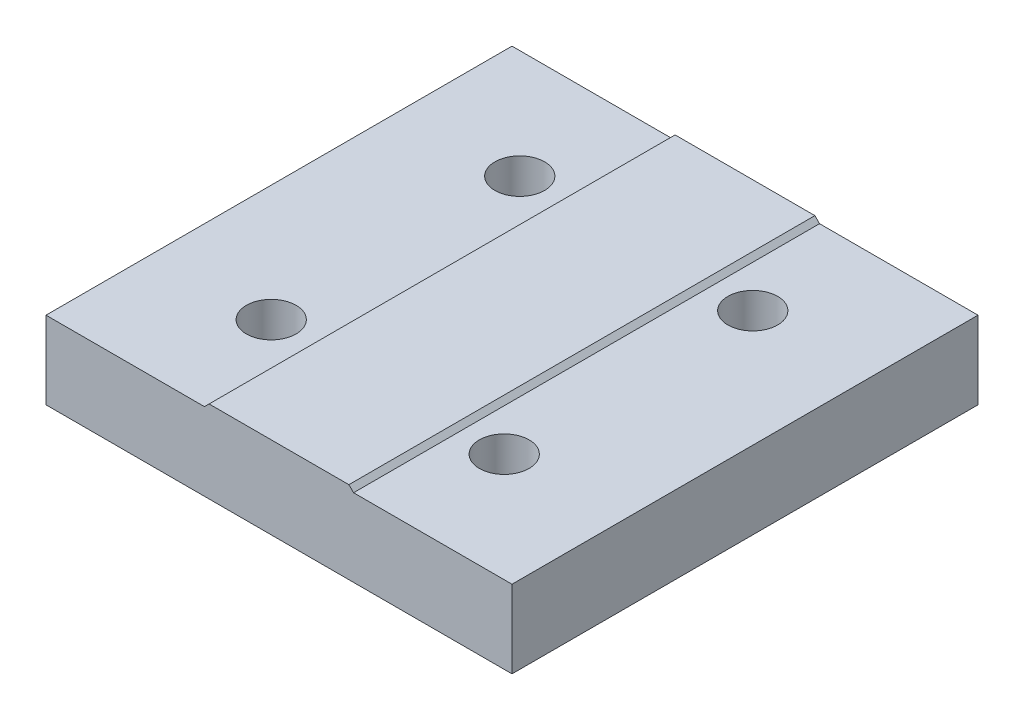
ISO-10303-21;
HEADER;
FILE_DESCRIPTION(('STEP AP214'),'2;1');
FILE_NAME('part.step','',(''),(''),'','','');
FILE_SCHEMA(('AUTOMOTIVE_DESIGN { 1 0 10303 214 1 1 1 1 }'));
ENDSEC;
DATA;
#1=APPLICATION_CONTEXT('core data for automotive mechanical design processes');
#2=APPLICATION_PROTOCOL_DEFINITION('international standard','automotive_design',2000,#1);
#3=PRODUCT_CONTEXT('',#1,'mechanical');
#4=PRODUCT('Part','Part','',(#3));
#5=PRODUCT_RELATED_PRODUCT_CATEGORY('part','',(#4));
#6=PRODUCT_DEFINITION_FORMATION('','',#4);
#7=PRODUCT_DEFINITION_CONTEXT('part definition',#1,'design');
#8=PRODUCT_DEFINITION('design','',#6,#7);
#9=PRODUCT_DEFINITION_SHAPE('','',#8);
#10=(LENGTH_UNIT() NAMED_UNIT(*) SI_UNIT(.MILLI.,.METRE.));
#11=(NAMED_UNIT(*) PLANE_ANGLE_UNIT() SI_UNIT($,.RADIAN.));
#12=(NAMED_UNIT(*) SI_UNIT($,.STERADIAN.) SOLID_ANGLE_UNIT());
#13=UNCERTAINTY_MEASURE_WITH_UNIT(LENGTH_MEASURE(1.E-05),#10,'distance_accuracy_value','');
#14=(GEOMETRIC_REPRESENTATION_CONTEXT(3) GLOBAL_UNCERTAINTY_ASSIGNED_CONTEXT((#13)) GLOBAL_UNIT_ASSIGNED_CONTEXT((#10,
#11,#12)) REPRESENTATION_CONTEXT('',''));
#15=CARTESIAN_POINT('',(0.,0.,0.));
#16=DIRECTION('',(0.,0.,1.));
#17=DIRECTION('',(1.,0.,0.));
#18=AXIS2_PLACEMENT_3D('',#15,#16,#17);
#19=CARTESIAN_POINT('',(0.,5.,0.));
#20=DIRECTION('',(0.,1.,0.));
#21=DIRECTION('',(0.,0.,1.));
#22=AXIS2_PLACEMENT_3D('',#19,#20,#21);
#23=PLANE('',#22);
#24=DIRECTION('',(0.,0.,1.));
#25=VECTOR('',#24,1.);
#26=CARTESIAN_POINT('',(10.2,5.,0.));
#27=LINE('',#26,#25);
#28=CARTESIAN_POINT('',(10.2,5.,0.));
#29=VERTEX_POINT('',#28);
#30=CARTESIAN_POINT('',(10.2,5.,30.));
#31=VERTEX_POINT('',#30);
#32=EDGE_CURVE('E123',#29,#31,#27,.T.);
#33=ORIENTED_EDGE('',*,*,#32,.F.);
#34=DIRECTION('',(-1.,0.,0.));
#35=VECTOR('',#34,1.);
#36=CARTESIAN_POINT('',(0.,5.,0.));
#37=LINE('',#36,#35);
#38=CARTESIAN_POINT('',(0.,5.,0.));
#39=VERTEX_POINT('',#38);
#40=EDGE_CURVE('E118',#29,#39,#37,.T.);
#41=ORIENTED_EDGE('',*,*,#40,.T.);
#42=DIRECTION('',(0.,0.,1.));
#43=VECTOR('',#42,1.);
#44=CARTESIAN_POINT('',(0.,5.,0.));
#45=LINE('',#44,#43);
#46=CARTESIAN_POINT('',(0.,5.,30.));
#47=VERTEX_POINT('',#46);
#48=EDGE_CURVE('E156',#39,#47,#45,.T.);
#49=ORIENTED_EDGE('',*,*,#48,.T.);
#50=DIRECTION('',(1.,0.,0.));
#51=VECTOR('',#50,1.);
#52=CARTESIAN_POINT('',(0.,5.,30.));
#53=LINE('',#52,#51);
#54=EDGE_CURVE('E161',#47,#31,#53,.T.);
#55=ORIENTED_EDGE('',*,*,#54,.T.);
#56=EDGE_LOOP('',(#33,#41,#49,#55));
#57=FACE_BOUND('',#56,.T.);
#58=CARTESIAN_POINT('',(7.50000000000017,5.,23.));
#59=DIRECTION('',(0.,1.,0.));
#60=DIRECTION('',(0.,0.,1.));
#61=AXIS2_PLACEMENT_3D('',#58,#59,#60);
#62=CIRCLE('',#61,1.6);
#63=CARTESIAN_POINT('',(7.50000000000017,5.,24.6));
#64=VERTEX_POINT('',#63);
#65=EDGE_CURVE('E131',#64,#64,#62,.T.);
#66=ORIENTED_EDGE('',*,*,#65,.F.);
#67=EDGE_LOOP('',(#66));
#68=FACE_BOUND('',#67,.T.);
#69=CARTESIAN_POINT('',(7.5,5.,7.));
#70=DIRECTION('',(0.,1.,0.));
#71=DIRECTION('',(0.,0.,1.));
#72=AXIS2_PLACEMENT_3D('',#69,#70,#71);
#73=CIRCLE('',#72,1.6);
#74=CARTESIAN_POINT('',(7.5,5.,8.6));
#75=VERTEX_POINT('',#74);
#76=EDGE_CURVE('E150',#75,#75,#73,.T.);
#77=ORIENTED_EDGE('',*,*,#76,.F.);
#78=EDGE_LOOP('',(#77));
#79=FACE_BOUND('',#78,.T.);
#80=ADVANCED_FACE('F37',(#57,#68,#79),#23,.T.);
#81=DIRECTION('',(0.,0.,-1.));
#82=VECTOR('',#81,1.);
#83=CARTESIAN_POINT('',(19.8,5.,0.));
#84=LINE('',#83,#82);
#85=CARTESIAN_POINT('',(19.8,5.,30.));
#86=VERTEX_POINT('',#85);
#87=CARTESIAN_POINT('',(19.8,5.,0.));
#88=VERTEX_POINT('',#87);
#89=EDGE_CURVE('E112',#86,#88,#84,.T.);
#90=ORIENTED_EDGE('',*,*,#89,.F.);
#91=CARTESIAN_POINT('',(30.,5.,30.));
#92=VERTEX_POINT('',#91);
#93=EDGE_CURVE('E159',#86,#92,#53,.T.);
#94=ORIENTED_EDGE('',*,*,#93,.T.);
#95=DIRECTION('',(0.,0.,-1.));
#96=VECTOR('',#95,1.);
#97=CARTESIAN_POINT('',(30.,5.,0.));
#98=LINE('',#97,#96);
#99=CARTESIAN_POINT('',(30.,5.,0.));
#100=VERTEX_POINT('',#99);
#101=EDGE_CURVE('E115',#92,#100,#98,.T.);
#102=ORIENTED_EDGE('',*,*,#101,.T.);
#103=EDGE_CURVE('E106',#100,#88,#37,.T.);
#104=ORIENTED_EDGE('',*,*,#103,.T.);
#105=EDGE_LOOP('',(#90,#94,#102,#104));
#106=FACE_BOUND('',#105,.T.);
#107=CARTESIAN_POINT('',(22.5000000000002,5.,23.));
#108=DIRECTION('',(0.,1.,0.));
#109=DIRECTION('',(0.,0.,1.));
#110=AXIS2_PLACEMENT_3D('',#107,#108,#109);
#111=CIRCLE('',#110,1.6);
#112=CARTESIAN_POINT('',(22.5000000000002,5.,24.6));
#113=VERTEX_POINT('',#112);
#114=EDGE_CURVE('E138',#113,#113,#111,.T.);
#115=ORIENTED_EDGE('',*,*,#114,.F.);
#116=EDGE_LOOP('',(#115));
#117=FACE_BOUND('',#116,.T.);
#118=CARTESIAN_POINT('',(22.5,5.,7.));
#119=DIRECTION('',(0.,1.,0.));
#120=DIRECTION('',(0.,0.,1.));
#121=AXIS2_PLACEMENT_3D('',#118,#119,#120);
#122=CIRCLE('',#121,1.6);
#123=CARTESIAN_POINT('',(22.5,5.,8.6));
#124=VERTEX_POINT('',#123);
#125=EDGE_CURVE('E144',#124,#124,#122,.T.);
#126=ORIENTED_EDGE('',*,*,#125,.F.);
#127=EDGE_LOOP('',(#126));
#128=FACE_BOUND('',#127,.T.);
#129=ADVANCED_FACE('F110',(#106,#117,#128),#23,.T.);
#130=CARTESIAN_POINT('',(0.,0.,0.));
#131=DIRECTION('',(0.,1.,0.));
#132=DIRECTION('',(0.,0.,1.));
#133=AXIS2_PLACEMENT_3D('',#130,#131,#132);
#134=PLANE('',#133);
#135=DIRECTION('',(0.,0.,1.));
#136=VECTOR('',#135,1.);
#137=CARTESIAN_POINT('',(0.,0.,0.));
#138=LINE('',#137,#136);
#139=CARTESIAN_POINT('',(0.,0.,0.));
#140=VERTEX_POINT('',#139);
#141=CARTESIAN_POINT('',(0.,0.,30.));
#142=VERTEX_POINT('',#141);
#143=EDGE_CURVE('E153',#140,#142,#138,.T.);
#144=ORIENTED_EDGE('',*,*,#143,.F.);
#145=DIRECTION('',(-1.,0.,0.));
#146=VECTOR('',#145,1.);
#147=CARTESIAN_POINT('',(0.,0.,0.));
#148=LINE('',#147,#146);
#149=CARTESIAN_POINT('',(30.,0.,0.));
#150=VERTEX_POINT('',#149);
#151=EDGE_CURVE('E160',#150,#140,#148,.T.);
#152=ORIENTED_EDGE('',*,*,#151,.F.);
#153=DIRECTION('',(0.,0.,-1.));
#154=VECTOR('',#153,1.);
#155=CARTESIAN_POINT('',(30.,0.,0.));
#156=LINE('',#155,#154);
#157=CARTESIAN_POINT('',(30.,0.,30.));
#158=VERTEX_POINT('',#157);
#159=EDGE_CURVE('E169',#158,#150,#156,.T.);
#160=ORIENTED_EDGE('',*,*,#159,.F.);
#161=DIRECTION('',(1.,0.,0.));
#162=VECTOR('',#161,1.);
#163=CARTESIAN_POINT('',(0.,0.,30.));
#164=LINE('',#163,#162);
#165=EDGE_CURVE('E167',#142,#158,#164,.T.);
#166=ORIENTED_EDGE('',*,*,#165,.F.);
#167=EDGE_LOOP('',(#144,#152,#160,#166));
#168=FACE_BOUND('',#167,.T.);
#169=CARTESIAN_POINT('',(7.5,0.,7.));
#170=DIRECTION('',(0.,1.,0.));
#171=DIRECTION('',(0.,0.,1.));
#172=AXIS2_PLACEMENT_3D('',#169,#170,#171);
#173=CIRCLE('',#172,1.6);
#174=CARTESIAN_POINT('',(7.5,0.,8.6));
#175=VERTEX_POINT('',#174);
#176=EDGE_CURVE('E147',#175,#175,#173,.T.);
#177=ORIENTED_EDGE('',*,*,#176,.T.);
#178=EDGE_LOOP('',(#177));
#179=FACE_BOUND('',#178,.T.);
#180=CARTESIAN_POINT('',(22.5,0.,7.));
#181=DIRECTION('',(0.,1.,0.));
#182=DIRECTION('',(0.,0.,1.));
#183=AXIS2_PLACEMENT_3D('',#180,#181,#182);
#184=CIRCLE('',#183,1.6);
#185=CARTESIAN_POINT('',(22.5,0.,8.6));
#186=VERTEX_POINT('',#185);
#187=EDGE_CURVE('E141',#186,#186,#184,.T.);
#188=ORIENTED_EDGE('',*,*,#187,.T.);
#189=EDGE_LOOP('',(#188));
#190=FACE_BOUND('',#189,.T.);
#191=CARTESIAN_POINT('',(22.5000000000002,0.,23.));
#192=DIRECTION('',(0.,1.,0.));
#193=DIRECTION('',(0.,0.,1.));
#194=AXIS2_PLACEMENT_3D('',#191,#192,#193);
#195=CIRCLE('',#194,1.6);
#196=CARTESIAN_POINT('',(22.5000000000002,0.,24.6));
#197=VERTEX_POINT('',#196);
#198=EDGE_CURVE('E134',#197,#197,#195,.T.);
#199=ORIENTED_EDGE('',*,*,#198,.T.);
#200=EDGE_LOOP('',(#199));
#201=FACE_BOUND('',#200,.T.);
#202=CARTESIAN_POINT('',(7.50000000000017,0.,23.));
#203=DIRECTION('',(0.,1.,0.));
#204=DIRECTION('',(0.,0.,1.));
#205=AXIS2_PLACEMENT_3D('',#202,#203,#204);
#206=CIRCLE('',#205,1.6);
#207=CARTESIAN_POINT('',(7.50000000000017,0.,24.6));
#208=VERTEX_POINT('',#207);
#209=EDGE_CURVE('E135',#208,#208,#206,.T.);
#210=ORIENTED_EDGE('',*,*,#209,.T.);
#211=EDGE_LOOP('',(#210));
#212=FACE_BOUND('',#211,.T.);
#213=ADVANCED_FACE('F213',(#168,#179,#190,#201,#212),#134,.F.);
#214=CARTESIAN_POINT('',(0.,5.,0.));
#215=DIRECTION('',(1.,0.,0.));
#216=DIRECTION('',(0.,0.,-1.));
#217=AXIS2_PLACEMENT_3D('',#214,#215,#216);
#218=PLANE('',#217);
#219=ORIENTED_EDGE('',*,*,#143,.T.);
#220=DIRECTION('',(0.,-1.,0.));
#221=VECTOR('',#220,1.);
#222=CARTESIAN_POINT('',(0.,5.,30.));
#223=LINE('',#222,#221);
#224=EDGE_CURVE('E179',#47,#142,#223,.T.);
#225=ORIENTED_EDGE('',*,*,#224,.F.);
#226=ORIENTED_EDGE('',*,*,#48,.F.);
#227=DIRECTION('',(0.,-1.,0.));
#228=VECTOR('',#227,1.);
#229=CARTESIAN_POINT('',(0.,5.,0.));
#230=LINE('',#229,#228);
#231=EDGE_CURVE('E117',#39,#140,#230,.T.);
#232=ORIENTED_EDGE('',*,*,#231,.T.);
#233=EDGE_LOOP('',(#219,#225,#226,#232));
#234=FACE_BOUND('',#233,.T.);
#235=ADVANCED_FACE('F220',(#234),#218,.F.);
#236=CARTESIAN_POINT('',(0.,5.,30.));
#237=DIRECTION('',(0.,0.,-1.));
#238=DIRECTION('',(-1.,0.,0.));
#239=AXIS2_PLACEMENT_3D('',#236,#237,#238);
#240=PLANE('',#239);
#241=ORIENTED_EDGE('',*,*,#93,.F.);
#242=DIRECTION('',(-0.707106781186544,0.707106781186552,0.));
#243=VECTOR('',#242,1.);
#244=CARTESIAN_POINT('',(19.5,5.3,30.));
#245=LINE('',#244,#243);
#246=CARTESIAN_POINT('',(19.5,5.3,30.));
#247=VERTEX_POINT('',#246);
#248=EDGE_CURVE('E11',#86,#247,#245,.T.);
#249=ORIENTED_EDGE('',*,*,#248,.T.);
#250=DIRECTION('',(1.,0.,0.));
#251=VECTOR('',#250,1.);
#252=CARTESIAN_POINT('',(10.2,5.3,30.));
#253=LINE('',#252,#251);
#254=CARTESIAN_POINT('',(10.5,5.3,30.));
#255=VERTEX_POINT('',#254);
#256=EDGE_CURVE('E122',#255,#247,#253,.T.);
#257=ORIENTED_EDGE('',*,*,#256,.F.);
#258=DIRECTION('',(-0.707106781186548,-0.707106781186548,0.));
#259=VECTOR('',#258,1.);
#260=CARTESIAN_POINT('',(10.5,5.3,30.));
#261=LINE('',#260,#259);
#262=EDGE_CURVE('E46',#255,#31,#261,.T.);
#263=ORIENTED_EDGE('',*,*,#262,.T.);
#264=ORIENTED_EDGE('',*,*,#54,.F.);
#265=ORIENTED_EDGE('',*,*,#224,.T.);
#266=ORIENTED_EDGE('',*,*,#165,.T.);
#267=DIRECTION('',(0.,-1.,0.));
#268=VECTOR('',#267,1.);
#269=CARTESIAN_POINT('',(30.,5.,30.));
#270=LINE('',#269,#268);
#271=EDGE_CURVE('E176',#92,#158,#270,.T.);
#272=ORIENTED_EDGE('',*,*,#271,.F.);
#273=EDGE_LOOP('',(#241,#249,#257,#263,#264,#265,#266,#272));
#274=FACE_BOUND('',#273,.T.);
#275=ADVANCED_FACE('F189',(#274),#240,.F.);
#276=CARTESIAN_POINT('',(30.,5.,0.));
#277=DIRECTION('',(-1.,0.,0.));
#278=DIRECTION('',(0.,0.,1.));
#279=AXIS2_PLACEMENT_3D('',#276,#277,#278);
#280=PLANE('',#279);
#281=ORIENTED_EDGE('',*,*,#159,.T.);
#282=DIRECTION('',(0.,-1.,0.));
#283=VECTOR('',#282,1.);
#284=CARTESIAN_POINT('',(30.,5.,0.));
#285=LINE('',#284,#283);
#286=EDGE_CURVE('E174',#100,#150,#285,.T.);
#287=ORIENTED_EDGE('',*,*,#286,.F.);
#288=ORIENTED_EDGE('',*,*,#101,.F.);
#289=ORIENTED_EDGE('',*,*,#271,.T.);
#290=EDGE_LOOP('',(#281,#287,#288,#289));
#291=FACE_BOUND('',#290,.T.);
#292=ADVANCED_FACE('F224',(#291),#280,.F.);
#293=CARTESIAN_POINT('',(0.,5.,0.));
#294=DIRECTION('',(0.,0.,1.));
#295=DIRECTION('',(1.,0.,0.));
#296=AXIS2_PLACEMENT_3D('',#293,#294,#295);
#297=PLANE('',#296);
#298=DIRECTION('',(-1.,0.,0.));
#299=VECTOR('',#298,1.);
#300=CARTESIAN_POINT('',(10.2,5.3,0.));
#301=LINE('',#300,#299);
#302=CARTESIAN_POINT('',(19.5,5.3,0.));
#303=VERTEX_POINT('',#302);
#304=CARTESIAN_POINT('',(10.5,5.3,0.));
#305=VERTEX_POINT('',#304);
#306=EDGE_CURVE('E107',#303,#305,#301,.T.);
#307=ORIENTED_EDGE('',*,*,#306,.F.);
#308=DIRECTION('',(0.707106781186544,-0.707106781186552,0.));
#309=VECTOR('',#308,1.);
#310=CARTESIAN_POINT('',(19.5,5.3,0.));
#311=LINE('',#310,#309);
#312=EDGE_CURVE('E61',#303,#88,#311,.T.);
#313=ORIENTED_EDGE('',*,*,#312,.T.);
#314=ORIENTED_EDGE('',*,*,#103,.F.);
#315=ORIENTED_EDGE('',*,*,#286,.T.);
#316=ORIENTED_EDGE('',*,*,#151,.T.);
#317=ORIENTED_EDGE('',*,*,#231,.F.);
#318=ORIENTED_EDGE('',*,*,#40,.F.);
#319=DIRECTION('',(0.707106781186548,0.707106781186548,0.));
#320=VECTOR('',#319,1.);
#321=CARTESIAN_POINT('',(10.5,5.3,0.));
#322=LINE('',#321,#320);
#323=EDGE_CURVE('E53',#29,#305,#322,.T.);
#324=ORIENTED_EDGE('',*,*,#323,.T.);
#325=EDGE_LOOP('',(#307,#313,#314,#315,#316,#317,#318,#324));
#326=FACE_BOUND('',#325,.T.);
#327=ADVANCED_FACE('F104',(#326),#297,.F.);
#328=CARTESIAN_POINT('',(7.5,5.,7.));
#329=DIRECTION('',(0.,-1.,0.));
#330=DIRECTION('',(0.,0.,-1.));
#331=AXIS2_PLACEMENT_3D('',#328,#329,#330);
#332=CYLINDRICAL_SURFACE('',#331,1.6);
#333=ORIENTED_EDGE('',*,*,#76,.T.);
#334=EDGE_LOOP('',(#333));
#335=FACE_BOUND('',#334,.T.);
#336=ORIENTED_EDGE('',*,*,#176,.F.);
#337=EDGE_LOOP('',(#336));
#338=FACE_BOUND('',#337,.T.);
#339=ADVANCED_FACE('F216',(#335,#338),#332,.F.);
#340=CARTESIAN_POINT('',(22.5,5.,7.));
#341=DIRECTION('',(0.,-1.,0.));
#342=DIRECTION('',(0.,0.,-1.));
#343=AXIS2_PLACEMENT_3D('',#340,#341,#342);
#344=CYLINDRICAL_SURFACE('',#343,1.6);
#345=ORIENTED_EDGE('',*,*,#125,.T.);
#346=EDGE_LOOP('',(#345));
#347=FACE_BOUND('',#346,.T.);
#348=ORIENTED_EDGE('',*,*,#187,.F.);
#349=EDGE_LOOP('',(#348));
#350=FACE_BOUND('',#349,.T.);
#351=ADVANCED_FACE('F255',(#347,#350),#344,.F.);
#352=CARTESIAN_POINT('',(22.5000000000002,5.,23.));
#353=DIRECTION('',(0.,-1.,0.));
#354=DIRECTION('',(0.,0.,-1.));
#355=AXIS2_PLACEMENT_3D('',#352,#353,#354);
#356=CYLINDRICAL_SURFACE('',#355,1.6);
#357=ORIENTED_EDGE('',*,*,#114,.T.);
#358=EDGE_LOOP('',(#357));
#359=FACE_BOUND('',#358,.T.);
#360=ORIENTED_EDGE('',*,*,#198,.F.);
#361=EDGE_LOOP('',(#360));
#362=FACE_BOUND('',#361,.T.);
#363=ADVANCED_FACE('F205',(#359,#362),#356,.F.);
#364=CARTESIAN_POINT('',(7.50000000000017,5.,23.));
#365=DIRECTION('',(0.,-1.,0.));
#366=DIRECTION('',(0.,0.,-1.));
#367=AXIS2_PLACEMENT_3D('',#364,#365,#366);
#368=CYLINDRICAL_SURFACE('',#367,1.6);
#369=ORIENTED_EDGE('',*,*,#65,.T.);
#370=EDGE_LOOP('',(#369));
#371=FACE_BOUND('',#370,.T.);
#372=ORIENTED_EDGE('',*,*,#209,.F.);
#373=EDGE_LOOP('',(#372));
#374=FACE_BOUND('',#373,.T.);
#375=ADVANCED_FACE('F199',(#371,#374),#368,.F.);
#376=CARTESIAN_POINT('',(0.,5.3,0.));
#377=DIRECTION('',(0.,1.,0.));
#378=DIRECTION('',(0.,0.,1.));
#379=AXIS2_PLACEMENT_3D('',#376,#377,#378);
#380=PLANE('',#379);
#381=ORIENTED_EDGE('',*,*,#256,.T.);
#382=DIRECTION('',(0.,0.,-1.));
#383=VECTOR('',#382,1.);
#384=CARTESIAN_POINT('',(19.5,5.3,0.));
#385=LINE('',#384,#383);
#386=EDGE_CURVE('E185',#247,#303,#385,.T.);
#387=ORIENTED_EDGE('',*,*,#386,.T.);
#388=ORIENTED_EDGE('',*,*,#306,.T.);
#389=DIRECTION('',(0.,0.,1.));
#390=VECTOR('',#389,1.);
#391=CARTESIAN_POINT('',(10.5,5.3,30.));
#392=LINE('',#391,#390);
#393=EDGE_CURVE('E182',#305,#255,#392,.T.);
#394=ORIENTED_EDGE('',*,*,#393,.T.);
#395=EDGE_LOOP('',(#381,#387,#388,#394));
#396=FACE_BOUND('',#395,.T.);
#397=ADVANCED_FACE('F197',(#396),#380,.T.);
#398=CARTESIAN_POINT('',(19.5,5.3,0.));
#399=DIRECTION('',(0.707106781186552,0.707106781186544,0.));
#400=DIRECTION('',(0.,0.,1.));
#401=AXIS2_PLACEMENT_3D('',#398,#399,#400);
#402=PLANE('',#401);
#403=ORIENTED_EDGE('',*,*,#248,.F.);
#404=ORIENTED_EDGE('',*,*,#89,.T.);
#405=ORIENTED_EDGE('',*,*,#312,.F.);
#406=ORIENTED_EDGE('',*,*,#386,.F.);
#407=EDGE_LOOP('',(#403,#404,#405,#406));
#408=FACE_BOUND('',#407,.T.);
#409=ADVANCED_FACE('F121',(#408),#402,.T.);
#410=CARTESIAN_POINT('',(10.5,5.3,0.));
#411=DIRECTION('',(-0.707106781186547,0.707106781186547,0.));
#412=DIRECTION('',(0.,0.,-1.));
#413=AXIS2_PLACEMENT_3D('',#410,#411,#412);
#414=PLANE('',#413);
#415=ORIENTED_EDGE('',*,*,#323,.F.);
#416=ORIENTED_EDGE('',*,*,#32,.T.);
#417=ORIENTED_EDGE('',*,*,#262,.F.);
#418=ORIENTED_EDGE('',*,*,#393,.F.);
#419=EDGE_LOOP('',(#415,#416,#417,#418));
#420=FACE_BOUND('',#419,.T.);
#421=ADVANCED_FACE('F40',(#420),#414,.T.);
#422=CLOSED_SHELL('',(#80,#129,#213,#235,#275,#292,#327,#339,#351,#363,#375,#397,#409,#421));
#423=MANIFOLD_SOLID_BREP('B2',#422);
#424=ADVANCED_BREP_SHAPE_REPRESENTATION('',(#18,#423),#14);
#425=SHAPE_DEFINITION_REPRESENTATION(#9,#424);
ENDSEC;
END-ISO-10303-21;
